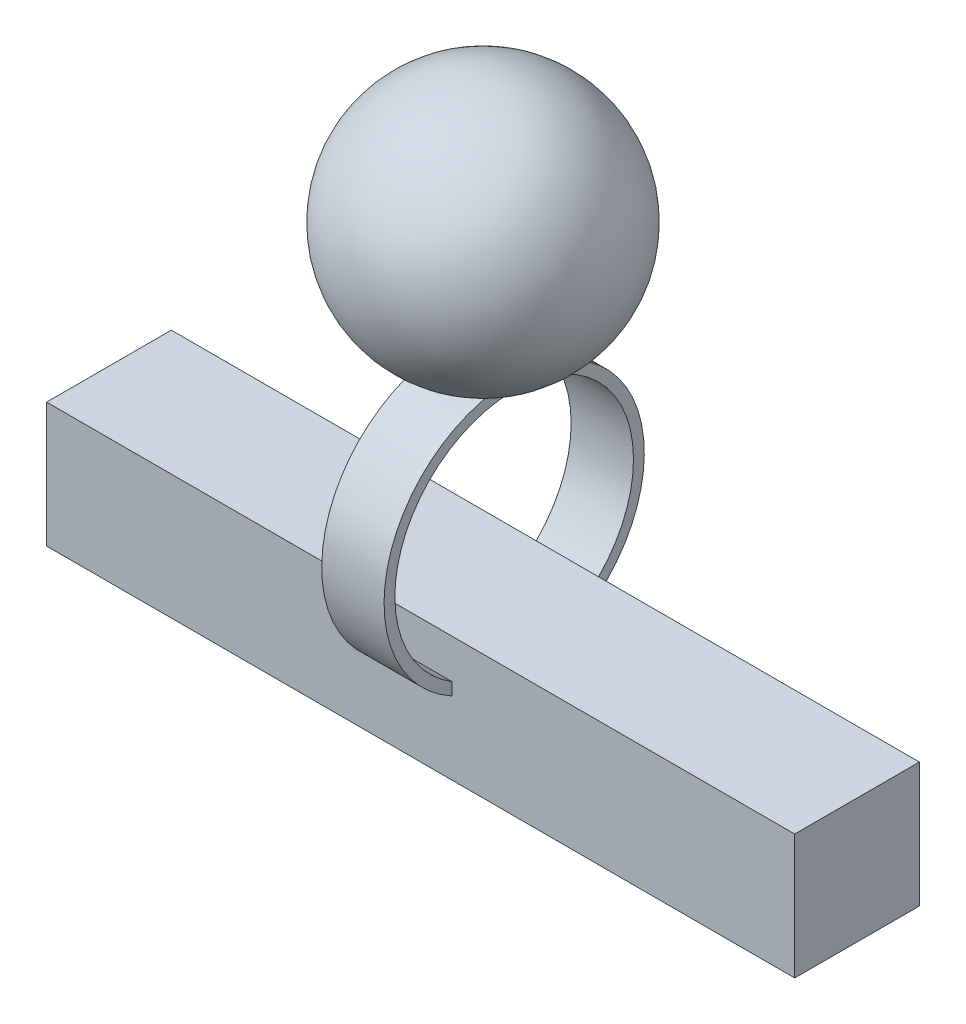
ISO-10303-21;
HEADER;
FILE_DESCRIPTION(('STEP AP214'),'2;1');
FILE_NAME('part.step','',(''),(''),'','','');
FILE_SCHEMA(('AUTOMOTIVE_DESIGN { 1 0 10303 214 1 1 1 1 }'));
ENDSEC;
DATA;
#1=APPLICATION_CONTEXT('core data for automotive mechanical design processes');
#2=APPLICATION_PROTOCOL_DEFINITION('international standard','automotive_design',2000,#1);
#3=PRODUCT_CONTEXT('',#1,'mechanical');
#4=PRODUCT('Part','Part','',(#3));
#5=PRODUCT_RELATED_PRODUCT_CATEGORY('part','',(#4));
#6=PRODUCT_DEFINITION_FORMATION('','',#4);
#7=PRODUCT_DEFINITION_CONTEXT('part definition',#1,'design');
#8=PRODUCT_DEFINITION('design','',#6,#7);
#9=PRODUCT_DEFINITION_SHAPE('','',#8);
#10=(LENGTH_UNIT() NAMED_UNIT(*) SI_UNIT(.MILLI.,.METRE.));
#11=(NAMED_UNIT(*) PLANE_ANGLE_UNIT() SI_UNIT($,.RADIAN.));
#12=(NAMED_UNIT(*) SI_UNIT($,.STERADIAN.) SOLID_ANGLE_UNIT());
#13=UNCERTAINTY_MEASURE_WITH_UNIT(LENGTH_MEASURE(1.E-05),#10,'distance_accuracy_value','');
#14=(GEOMETRIC_REPRESENTATION_CONTEXT(3) GLOBAL_UNCERTAINTY_ASSIGNED_CONTEXT((#13)) GLOBAL_UNIT_ASSIGNED_CONTEXT((#10,
#11,#12)) REPRESENTATION_CONTEXT('',''));
#15=CARTESIAN_POINT('',(0.,0.,0.));
#16=DIRECTION('',(0.,0.,1.));
#17=DIRECTION('',(1.,0.,0.));
#18=AXIS2_PLACEMENT_3D('',#15,#16,#17);
#19=CARTESIAN_POINT('',(-1.25,0.919872981077808,2.5));
#20=DIRECTION('',(1.,0.,0.));
#21=DIRECTION('',(0.,0.,-1.));
#22=AXIS2_PLACEMENT_3D('',#19,#20,#21);
#23=PLANE('',#22);
#24=CARTESIAN_POINT('',(-1.25,5.,0.));
#25=DIRECTION('',(1.,0.,0.));
#26=DIRECTION('',(0.,-0.8526685640286,0.522452217831837));
#27=AXIS2_PLACEMENT_3D('',#24,#25,#26);
#28=CIRCLE('',#27,4.78512659085827);
#29=CARTESIAN_POINT('',(-1.25,0.919872981077807,2.5));
#30=VERTEX_POINT('',#29);
#31=EDGE_CURVE('E78',#30,#30,#28,.T.);
#32=ORIENTED_EDGE('',*,*,#31,.T.);
#33=EDGE_LOOP('',(#32));
#34=FACE_BOUND('',#33,.T.);
#35=CARTESIAN_POINT('',(-1.25,5.,0.));
#36=DIRECTION('',(1.,0.,0.));
#37=DIRECTION('',(0.,-0.87775463699659,0.479110422795188));
#38=AXIS2_PLACEMENT_3D('',#35,#36,#37);
#39=CIRCLE('',#38,5.2180037858803);
#40=CARTESIAN_POINT('',(-1.25,0.419872981077807,2.5));
#41=VERTEX_POINT('',#40);
#42=EDGE_CURVE('E79',#41,#41,#39,.T.);
#43=ORIENTED_EDGE('',*,*,#42,.F.);
#44=EDGE_LOOP('',(#43));
#45=FACE_BOUND('',#44,.T.);
#46=ADVANCED_FACE('F44',(#34,#45),#23,.F.);
#47=CARTESIAN_POINT('',(0.,5.,0.));
#48=DIRECTION('',(1.,0.,0.));
#49=DIRECTION('',(0.,0.,-1.));
#50=AXIS2_PLACEMENT_3D('',#47,#48,#49);
#51=CYLINDRICAL_SURFACE('',#50,5.2180037858803);
#52=DIRECTION('',(1.,0.,0.));
#53=VECTOR('',#52,1.);
#54=CARTESIAN_POINT('',(-1.25,0.419872981077808,2.5));
#55=LINE('',#54,#53);
#56=CARTESIAN_POINT('',(1.25,0.419872981077807,2.5));
#57=VERTEX_POINT('',#56);
#58=EDGE_CURVE('E67',#41,#57,#55,.T.);
#59=ORIENTED_EDGE('',*,*,#58,.T.);
#60=CARTESIAN_POINT('',(1.25,5.,0.));
#61=DIRECTION('',(1.,0.,0.));
#62=DIRECTION('',(0.,-0.87775463699659,0.479110422795188));
#63=AXIS2_PLACEMENT_3D('',#60,#61,#62);
#64=CIRCLE('',#63,5.2180037858803);
#65=EDGE_CURVE('E53',#57,#57,#64,.T.);
#66=ORIENTED_EDGE('',*,*,#65,.F.);
#67=ORIENTED_EDGE('',*,*,#58,.F.);
#68=ORIENTED_EDGE('',*,*,#42,.T.);
#69=EDGE_LOOP('',(#59,#66,#67,#68));
#70=FACE_BOUND('',#69,.T.);
#71=ADVANCED_FACE('F90',(#70),#51,.T.);
#72=CARTESIAN_POINT('',(1.25,0.919872981077808,2.5));
#73=DIRECTION('',(-1.,0.,0.));
#74=DIRECTION('',(0.,0.,1.));
#75=AXIS2_PLACEMENT_3D('',#72,#73,#74);
#76=PLANE('',#75);
#77=ORIENTED_EDGE('',*,*,#65,.T.);
#78=EDGE_LOOP('',(#77));
#79=FACE_BOUND('',#78,.T.);
#80=CARTESIAN_POINT('',(1.25,5.,0.));
#81=DIRECTION('',(1.,0.,0.));
#82=DIRECTION('',(0.,-0.8526685640286,0.522452217831837));
#83=AXIS2_PLACEMENT_3D('',#80,#81,#82);
#84=CIRCLE('',#83,4.78512659085827);
#85=CARTESIAN_POINT('',(1.25,0.919872981077807,2.5));
#86=VERTEX_POINT('',#85);
#87=EDGE_CURVE('E12',#86,#86,#84,.T.);
#88=ORIENTED_EDGE('',*,*,#87,.F.);
#89=EDGE_LOOP('',(#88));
#90=FACE_BOUND('',#89,.T.);
#91=ADVANCED_FACE('F89',(#79,#90),#76,.F.);
#92=CARTESIAN_POINT('',(0.,5.,0.));
#93=DIRECTION('',(1.,0.,0.));
#94=DIRECTION('',(0.,0.,-1.));
#95=AXIS2_PLACEMENT_3D('',#92,#93,#94);
#96=CYLINDRICAL_SURFACE('',#95,4.78512659085827);
#97=DIRECTION('',(-1.,0.,0.));
#98=VECTOR('',#97,1.);
#99=CARTESIAN_POINT('',(-1.25,0.919872981077808,2.5));
#100=LINE('',#99,#98);
#101=EDGE_CURVE('E48',#86,#30,#100,.T.);
#102=ORIENTED_EDGE('',*,*,#101,.T.);
#103=ORIENTED_EDGE('',*,*,#31,.F.);
#104=ORIENTED_EDGE('',*,*,#101,.F.);
#105=ORIENTED_EDGE('',*,*,#87,.T.);
#106=EDGE_LOOP('',(#102,#103,#104,#105));
#107=FACE_BOUND('',#106,.T.);
#108=ADVANCED_FACE('F46',(#107),#96,.F.);
#109=CLOSED_SHELL('',(#46,#71,#91,#108));
#110=MANIFOLD_SOLID_BREP('B2',#109);
#111=CARTESIAN_POINT('',(0.,15.,0.));
#112=DIRECTION('',(0.,-1.,0.));
#113=DIRECTION('',(0.,0.,1.));
#114=AXIS2_PLACEMENT_3D('',#111,#112,#113);
#115=SPHERICAL_SURFACE('',#114,5.);
#116=CARTESIAN_POINT('',(0.,10.,0.));
#117=VERTEX_POINT('',#116);
#118=VERTEX_LOOP('',#117);
#119=FACE_BOUND('',#118,.T.);
#120=ADVANCED_FACE('F133',(#119),#115,.T.);
#121=CLOSED_SHELL('',(#120));
#122=MANIFOLD_SOLID_BREP('B6',#121);
#123=CARTESIAN_POINT('',(15.,2.5,-2.5));
#124=DIRECTION('',(0.,0.,1.));
#125=DIRECTION('',(0.,-1.,0.));
#126=AXIS2_PLACEMENT_3D('',#123,#124,#125);
#127=PLANE('',#126);
#128=DIRECTION('',(0.,1.,0.));
#129=VECTOR('',#128,1.);
#130=CARTESIAN_POINT('',(-15.,2.5,-2.5));
#131=LINE('',#130,#129);
#132=CARTESIAN_POINT('',(-15.,-2.5,-2.5));
#133=VERTEX_POINT('',#132);
#134=CARTESIAN_POINT('',(-15.,2.5,-2.5));
#135=VERTEX_POINT('',#134);
#136=EDGE_CURVE('E209',#133,#135,#131,.T.);
#137=ORIENTED_EDGE('',*,*,#136,.T.);
#138=DIRECTION('',(-1.,0.,0.));
#139=VECTOR('',#138,1.);
#140=CARTESIAN_POINT('',(15.,2.5,-2.5));
#141=LINE('',#140,#139);
#142=CARTESIAN_POINT('',(15.,2.5,-2.5));
#143=VERTEX_POINT('',#142);
#144=EDGE_CURVE('E131',#143,#135,#141,.T.);
#145=ORIENTED_EDGE('',*,*,#144,.F.);
#146=DIRECTION('',(0.,1.,0.));
#147=VECTOR('',#146,1.);
#148=CARTESIAN_POINT('',(15.,2.5,-2.5));
#149=LINE('',#148,#147);
#150=CARTESIAN_POINT('',(15.,-2.5,-2.5));
#151=VERTEX_POINT('',#150);
#152=EDGE_CURVE('E197',#151,#143,#149,.T.);
#153=ORIENTED_EDGE('',*,*,#152,.F.);
#154=DIRECTION('',(-1.,0.,0.));
#155=VECTOR('',#154,1.);
#156=CARTESIAN_POINT('',(15.,-2.5,-2.5));
#157=LINE('',#156,#155);
#158=EDGE_CURVE('E205',#151,#133,#157,.T.);
#159=ORIENTED_EDGE('',*,*,#158,.T.);
#160=EDGE_LOOP('',(#137,#145,#153,#159));
#161=FACE_BOUND('',#160,.T.);
#162=ADVANCED_FACE('F146',(#161),#127,.F.);
#163=CARTESIAN_POINT('',(15.,2.5,2.5));
#164=DIRECTION('',(0.,-1.,0.));
#165=DIRECTION('',(0.,0.,-1.));
#166=AXIS2_PLACEMENT_3D('',#163,#164,#165);
#167=PLANE('',#166);
#168=DIRECTION('',(0.,0.,1.));
#169=VECTOR('',#168,1.);
#170=CARTESIAN_POINT('',(-15.,2.5,2.5));
#171=LINE('',#170,#169);
#172=CARTESIAN_POINT('',(-15.,2.5,2.5));
#173=VERTEX_POINT('',#172);
#174=EDGE_CURVE('E201',#135,#173,#171,.T.);
#175=ORIENTED_EDGE('',*,*,#174,.T.);
#176=DIRECTION('',(-1.,0.,0.));
#177=VECTOR('',#176,1.);
#178=CARTESIAN_POINT('',(15.,2.5,2.5));
#179=LINE('',#178,#177);
#180=CARTESIAN_POINT('',(15.,2.5,2.5));
#181=VERTEX_POINT('',#180);
#182=EDGE_CURVE('E154',#181,#173,#179,.T.);
#183=ORIENTED_EDGE('',*,*,#182,.F.);
#184=DIRECTION('',(0.,0.,1.));
#185=VECTOR('',#184,1.);
#186=CARTESIAN_POINT('',(15.,2.5,2.5));
#187=LINE('',#186,#185);
#188=EDGE_CURVE('E192',#143,#181,#187,.T.);
#189=ORIENTED_EDGE('',*,*,#188,.F.);
#190=ORIENTED_EDGE('',*,*,#144,.T.);
#191=EDGE_LOOP('',(#175,#183,#189,#190));
#192=FACE_BOUND('',#191,.T.);
#193=ADVANCED_FACE('F200',(#192),#167,.F.);
#194=CARTESIAN_POINT('',(15.,2.5,2.5));
#195=DIRECTION('',(0.,0.,-1.));
#196=DIRECTION('',(0.,1.,0.));
#197=AXIS2_PLACEMENT_3D('',#194,#195,#196);
#198=PLANE('',#197);
#199=DIRECTION('',(0.,-1.,0.));
#200=VECTOR('',#199,1.);
#201=CARTESIAN_POINT('',(-15.,2.5,2.5));
#202=LINE('',#201,#200);
#203=CARTESIAN_POINT('',(-15.,-2.5,2.5));
#204=VERTEX_POINT('',#203);
#205=EDGE_CURVE('E179',#173,#204,#202,.T.);
#206=ORIENTED_EDGE('',*,*,#205,.T.);
#207=DIRECTION('',(-1.,0.,0.));
#208=VECTOR('',#207,1.);
#209=CARTESIAN_POINT('',(15.,-2.5,2.5));
#210=LINE('',#209,#208);
#211=CARTESIAN_POINT('',(15.,-2.5,2.5));
#212=VERTEX_POINT('',#211);
#213=EDGE_CURVE('E202',#212,#204,#210,.T.);
#214=ORIENTED_EDGE('',*,*,#213,.F.);
#215=DIRECTION('',(0.,-1.,0.));
#216=VECTOR('',#215,1.);
#217=CARTESIAN_POINT('',(15.,2.5,2.5));
#218=LINE('',#217,#216);
#219=EDGE_CURVE('E195',#181,#212,#218,.T.);
#220=ORIENTED_EDGE('',*,*,#219,.F.);
#221=ORIENTED_EDGE('',*,*,#182,.T.);
#222=EDGE_LOOP('',(#206,#214,#220,#221));
#223=FACE_BOUND('',#222,.T.);
#224=ADVANCED_FACE('F203',(#223),#198,.F.);
#225=CARTESIAN_POINT('',(15.,-2.5,2.5));
#226=DIRECTION('',(0.,1.,0.));
#227=DIRECTION('',(0.,0.,1.));
#228=AXIS2_PLACEMENT_3D('',#225,#226,#227);
#229=PLANE('',#228);
#230=DIRECTION('',(0.,0.,-1.));
#231=VECTOR('',#230,1.);
#232=CARTESIAN_POINT('',(-15.,-2.5,2.5));
#233=LINE('',#232,#231);
#234=EDGE_CURVE('E185',#204,#133,#233,.T.);
#235=ORIENTED_EDGE('',*,*,#234,.T.);
#236=ORIENTED_EDGE('',*,*,#158,.F.);
#237=DIRECTION('',(0.,0.,-1.));
#238=VECTOR('',#237,1.);
#239=CARTESIAN_POINT('',(15.,-2.5,2.5));
#240=LINE('',#239,#238);
#241=EDGE_CURVE('E162',#212,#151,#240,.T.);
#242=ORIENTED_EDGE('',*,*,#241,.F.);
#243=ORIENTED_EDGE('',*,*,#213,.T.);
#244=EDGE_LOOP('',(#235,#236,#242,#243));
#245=FACE_BOUND('',#244,.T.);
#246=ADVANCED_FACE('F216',(#245),#229,.F.);
#247=CARTESIAN_POINT('',(15.,0.,0.));
#248=DIRECTION('',(1.,0.,0.));
#249=DIRECTION('',(0.,0.,-1.));
#250=AXIS2_PLACEMENT_3D('',#247,#248,#249);
#251=PLANE('',#250);
#252=ORIENTED_EDGE('',*,*,#152,.T.);
#253=ORIENTED_EDGE('',*,*,#188,.T.);
#254=ORIENTED_EDGE('',*,*,#219,.T.);
#255=ORIENTED_EDGE('',*,*,#241,.T.);
#256=EDGE_LOOP('',(#252,#253,#254,#255));
#257=FACE_BOUND('',#256,.T.);
#258=ADVANCED_FACE('F193',(#257),#251,.T.);
#259=CARTESIAN_POINT('',(-15.,0.,0.));
#260=DIRECTION('',(1.,0.,0.));
#261=DIRECTION('',(0.,0.,-1.));
#262=AXIS2_PLACEMENT_3D('',#259,#260,#261);
#263=PLANE('',#262);
#264=ORIENTED_EDGE('',*,*,#136,.F.);
#265=ORIENTED_EDGE('',*,*,#234,.F.);
#266=ORIENTED_EDGE('',*,*,#205,.F.);
#267=ORIENTED_EDGE('',*,*,#174,.F.);
#268=EDGE_LOOP('',(#264,#265,#266,#267));
#269=FACE_BOUND('',#268,.T.);
#270=ADVANCED_FACE('F219',(#269),#263,.F.);
#271=CLOSED_SHELL('',(#162,#193,#224,#246,#258,#270));
#272=MANIFOLD_SOLID_BREP('B40',#271);
#273=ADVANCED_BREP_SHAPE_REPRESENTATION('',(#18,#110,#122,#272),#14);
#274=SHAPE_DEFINITION_REPRESENTATION(#9,#273);
ENDSEC;
END-ISO-10303-21;
